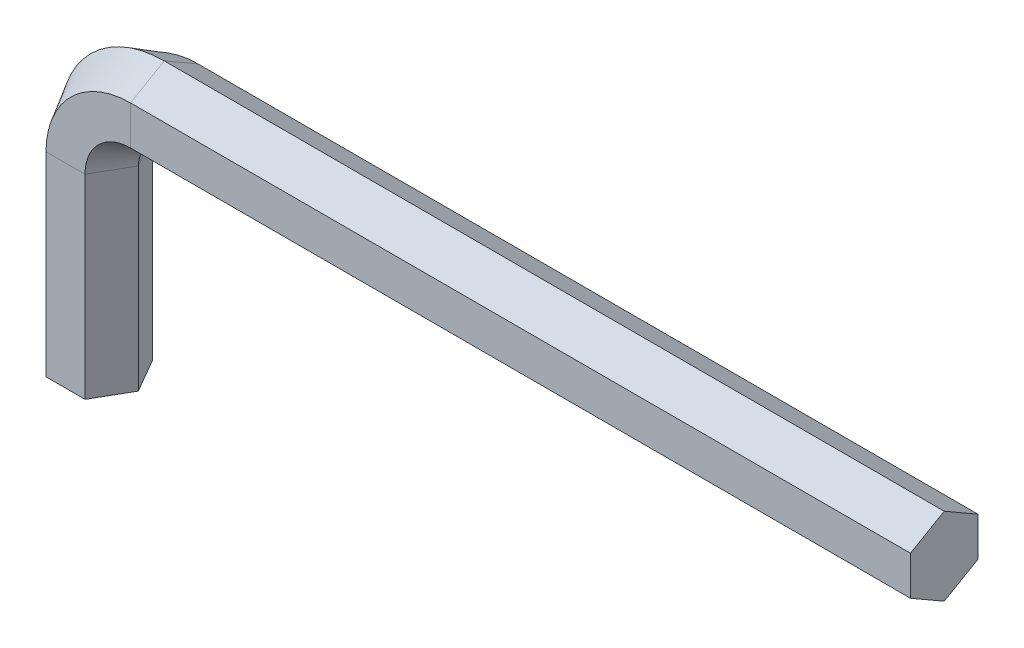
ISO-10303-21;
HEADER;
FILE_DESCRIPTION(('STEP AP214'),'2;1');
FILE_NAME('part.step','',(''),(''),'','','');
FILE_SCHEMA(('AUTOMOTIVE_DESIGN { 1 0 10303 214 1 1 1 1 }'));
ENDSEC;
DATA;
#1=APPLICATION_CONTEXT('core data for automotive mechanical design processes');
#2=APPLICATION_PROTOCOL_DEFINITION('international standard','automotive_design',2000,#1);
#3=PRODUCT_CONTEXT('',#1,'mechanical');
#4=PRODUCT('Part','Part','',(#3));
#5=PRODUCT_RELATED_PRODUCT_CATEGORY('part','',(#4));
#6=PRODUCT_DEFINITION_FORMATION('','',#4);
#7=PRODUCT_DEFINITION_CONTEXT('part definition',#1,'design');
#8=PRODUCT_DEFINITION('design','',#6,#7);
#9=PRODUCT_DEFINITION_SHAPE('','',#8);
#10=(LENGTH_UNIT() NAMED_UNIT(*) SI_UNIT(.MILLI.,.METRE.));
#11=(NAMED_UNIT(*) PLANE_ANGLE_UNIT() SI_UNIT($,.RADIAN.));
#12=(NAMED_UNIT(*) SI_UNIT($,.STERADIAN.) SOLID_ANGLE_UNIT());
#13=UNCERTAINTY_MEASURE_WITH_UNIT(LENGTH_MEASURE(1.E-05),#10,'distance_accuracy_value','');
#14=(GEOMETRIC_REPRESENTATION_CONTEXT(3) GLOBAL_UNCERTAINTY_ASSIGNED_CONTEXT((#13)) GLOBAL_UNIT_ASSIGNED_CONTEXT((#10,
#11,#12)) REPRESENTATION_CONTEXT('',''));
#15=CARTESIAN_POINT('',(0.,0.,0.));
#16=DIRECTION('',(0.,0.,1.));
#17=DIRECTION('',(1.,0.,0.));
#18=AXIS2_PLACEMENT_3D('',#15,#16,#17);
#19=CARTESIAN_POINT('',(0.,0.,0.));
#20=DIRECTION('',(0.,1.,0.));
#21=DIRECTION('',(0.,0.,1.));
#22=AXIS2_PLACEMENT_3D('',#19,#20,#21);
#23=PLANE('',#22);
#24=DIRECTION('',(0.499999999999995,0.,-0.866025403784442));
#25=VECTOR('',#24,1.);
#26=CARTESIAN_POINT('',(1.50000000000003,0.,2.59807621135329));
#27=LINE('',#26,#25);
#28=CARTESIAN_POINT('',(1.50000000000003,0.,2.59807621135329));
#29=VERTEX_POINT('',#28);
#30=CARTESIAN_POINT('',(2.99999999999999,0.,0.));
#31=VERTEX_POINT('',#30);
#32=EDGE_CURVE('E182',#29,#31,#27,.T.);
#33=ORIENTED_EDGE('',*,*,#32,.F.);
#34=DIRECTION('',(1.,0.,0.));
#35=VECTOR('',#34,1.);
#36=CARTESIAN_POINT('',(-1.49999999999997,0.,2.59807621135332));
#37=LINE('',#36,#35);
#38=CARTESIAN_POINT('',(-1.49999999999997,0.,2.59807621135332));
#39=VERTEX_POINT('',#38);
#40=EDGE_CURVE('E224',#39,#29,#37,.T.);
#41=ORIENTED_EDGE('',*,*,#40,.F.);
#42=DIRECTION('',(0.500000000000007,0.,0.866025403784435));
#43=VECTOR('',#42,1.);
#44=CARTESIAN_POINT('',(-2.99999999999999,0.,0.));
#45=LINE('',#44,#43);
#46=CARTESIAN_POINT('',(-2.99999999999999,0.,0.));
#47=VERTEX_POINT('',#46);
#48=EDGE_CURVE('E211',#47,#39,#45,.T.);
#49=ORIENTED_EDGE('',*,*,#48,.F.);
#50=DIRECTION('',(-0.499999999999995,0.,0.866025403784441));
#51=VECTOR('',#50,1.);
#52=CARTESIAN_POINT('',(-1.50000000000001,0.,-2.5980762113533));
#53=LINE('',#52,#51);
#54=CARTESIAN_POINT('',(-1.50000000000001,0.,-2.5980762113533));
#55=VERTEX_POINT('',#54);
#56=EDGE_CURVE('E134',#55,#47,#53,.T.);
#57=ORIENTED_EDGE('',*,*,#56,.F.);
#58=DIRECTION('',(-1.,0.,0.));
#59=VECTOR('',#58,1.);
#60=CARTESIAN_POINT('',(1.49999999999999,0.,-2.59807621135331));
#61=LINE('',#60,#59);
#62=CARTESIAN_POINT('',(1.49999999999999,0.,-2.59807621135331));
#63=VERTEX_POINT('',#62);
#64=EDGE_CURVE('E138',#63,#55,#61,.T.);
#65=ORIENTED_EDGE('',*,*,#64,.F.);
#66=DIRECTION('',(-0.500000000000001,0.,-0.866025403784438));
#67=VECTOR('',#66,1.);
#68=CARTESIAN_POINT('',(2.99999999999999,0.,0.));
#69=LINE('',#68,#67);
#70=EDGE_CURVE('E143',#31,#63,#69,.T.);
#71=ORIENTED_EDGE('',*,*,#70,.F.);
#72=EDGE_LOOP('',(#33,#41,#49,#57,#65,#71));
#73=FACE_BOUND('',#72,.T.);
#74=ADVANCED_FACE('F33',(#73),#23,.F.);
#75=CARTESIAN_POINT('',(65.,20.,0.));
#76=DIRECTION('',(1.,0.,0.));
#77=DIRECTION('',(0.,0.,1.));
#78=AXIS2_PLACEMENT_3D('',#75,#76,#77);
#79=PLANE('',#78);
#80=DIRECTION('',(0.,-0.499999999999995,-0.866025403784442));
#81=VECTOR('',#80,1.);
#82=CARTESIAN_POINT('',(65.,18.5,2.59807621135329));
#83=LINE('',#82,#81);
#84=CARTESIAN_POINT('',(65.,18.5,2.59807621135329));
#85=VERTEX_POINT('',#84);
#86=CARTESIAN_POINT('',(65.,17.,0.));
#87=VERTEX_POINT('',#86);
#88=EDGE_CURVE('E154',#85,#87,#83,.T.);
#89=ORIENTED_EDGE('',*,*,#88,.T.);
#90=DIRECTION('',(0.,0.500000000000001,-0.866025403784438));
#91=VECTOR('',#90,1.);
#92=CARTESIAN_POINT('',(65.,17.,0.));
#93=LINE('',#92,#91);
#94=CARTESIAN_POINT('',(65.,18.5,-2.59807621135331));
#95=VERTEX_POINT('',#94);
#96=EDGE_CURVE('E157',#87,#95,#93,.T.);
#97=ORIENTED_EDGE('',*,*,#96,.T.);
#98=DIRECTION('',(0.,1.,0.));
#99=VECTOR('',#98,1.);
#100=CARTESIAN_POINT('',(65.,18.5,-2.59807621135331));
#101=LINE('',#100,#99);
#102=CARTESIAN_POINT('',(65.,21.5,-2.5980762113533));
#103=VERTEX_POINT('',#102);
#104=EDGE_CURVE('E197',#95,#103,#101,.T.);
#105=ORIENTED_EDGE('',*,*,#104,.T.);
#106=DIRECTION('',(0.,0.499999999999995,0.866025403784441));
#107=VECTOR('',#106,1.);
#108=CARTESIAN_POINT('',(65.,21.5,-2.5980762113533));
#109=LINE('',#108,#107);
#110=CARTESIAN_POINT('',(65.,23.,0.));
#111=VERTEX_POINT('',#110);
#112=EDGE_CURVE('E52',#103,#111,#109,.T.);
#113=ORIENTED_EDGE('',*,*,#112,.T.);
#114=DIRECTION('',(0.,-0.500000000000007,0.866025403784435));
#115=VECTOR('',#114,1.);
#116=CARTESIAN_POINT('',(65.,23.,0.));
#117=LINE('',#116,#115);
#118=CARTESIAN_POINT('',(65.,21.5,2.59807621135332));
#119=VERTEX_POINT('',#118);
#120=EDGE_CURVE('E46',#111,#119,#117,.T.);
#121=ORIENTED_EDGE('',*,*,#120,.T.);
#122=DIRECTION('',(0.,-1.,0.));
#123=VECTOR('',#122,1.);
#124=CARTESIAN_POINT('',(65.,21.5,2.59807621135332));
#125=LINE('',#124,#123);
#126=EDGE_CURVE('E11',#119,#85,#125,.T.);
#127=ORIENTED_EDGE('',*,*,#126,.T.);
#128=EDGE_LOOP('',(#89,#97,#105,#113,#121,#127));
#129=FACE_BOUND('',#128,.T.);
#130=ADVANCED_FACE('F156',(#129),#79,.T.);
#131=CARTESIAN_POINT('',(1.50000000000003,0.,2.59807621135329));
#132=DIRECTION('',(0.866025403784441,0.,0.499999999999995));
#133=DIRECTION('',(0.499999999999995,0.,-0.866025403784441));
#134=AXIS2_PLACEMENT_3D('',#131,#132,#133);
#135=PLANE('',#134);
#136=DIRECTION('',(0.,1.,0.));
#137=VECTOR('',#136,1.);
#138=CARTESIAN_POINT('',(2.99999999999999,0.,0.));
#139=LINE('',#138,#137);
#140=CARTESIAN_POINT('',(2.99999999999999,15.,0.));
#141=VERTEX_POINT('',#140);
#142=EDGE_CURVE('E187',#31,#141,#139,.T.);
#143=ORIENTED_EDGE('',*,*,#142,.T.);
#144=DIRECTION('',(0.499999999999995,0.,-0.866025403784442));
#145=VECTOR('',#144,1.);
#146=CARTESIAN_POINT('',(1.50000000000003,15.,2.59807621135329));
#147=LINE('',#146,#145);
#148=CARTESIAN_POINT('',(1.50000000000003,15.,2.59807621135329));
#149=VERTEX_POINT('',#148);
#150=EDGE_CURVE('E256',#149,#141,#147,.T.);
#151=ORIENTED_EDGE('',*,*,#150,.F.);
#152=DIRECTION('',(0.,1.,0.));
#153=VECTOR('',#152,1.);
#154=CARTESIAN_POINT('',(1.50000000000003,0.,2.59807621135329));
#155=LINE('',#154,#153);
#156=EDGE_CURVE('E238',#29,#149,#155,.T.);
#157=ORIENTED_EDGE('',*,*,#156,.F.);
#158=ORIENTED_EDGE('',*,*,#32,.T.);
#159=EDGE_LOOP('',(#143,#151,#157,#158));
#160=FACE_BOUND('',#159,.T.);
#161=ADVANCED_FACE('F263',(#160),#135,.T.);
#162=CARTESIAN_POINT('',(2.99999999999999,0.,0.));
#163=DIRECTION('',(0.866025403784438,0.,-0.500000000000001));
#164=DIRECTION('',(-0.500000000000001,0.,-0.866025403784438));
#165=AXIS2_PLACEMENT_3D('',#162,#163,#164);
#166=PLANE('',#165);
#167=DIRECTION('',(0.,1.,0.));
#168=VECTOR('',#167,1.);
#169=CARTESIAN_POINT('',(1.49999999999999,0.,-2.59807621135331));
#170=LINE('',#169,#168);
#171=CARTESIAN_POINT('',(1.49999999999999,15.,-2.59807621135331));
#172=VERTEX_POINT('',#171);
#173=EDGE_CURVE('E186',#63,#172,#170,.T.);
#174=ORIENTED_EDGE('',*,*,#173,.T.);
#175=DIRECTION('',(-0.500000000000001,0.,-0.866025403784438));
#176=VECTOR('',#175,1.);
#177=CARTESIAN_POINT('',(2.99999999999999,15.,0.));
#178=LINE('',#177,#176);
#179=EDGE_CURVE('E183',#141,#172,#178,.T.);
#180=ORIENTED_EDGE('',*,*,#179,.F.);
#181=ORIENTED_EDGE('',*,*,#142,.F.);
#182=ORIENTED_EDGE('',*,*,#70,.T.);
#183=EDGE_LOOP('',(#174,#180,#181,#182));
#184=FACE_BOUND('',#183,.T.);
#185=ADVANCED_FACE('F266',(#184),#166,.T.);
#186=CARTESIAN_POINT('',(1.49999999999999,0.,-2.59807621135331));
#187=DIRECTION('',(0.,0.,-1.));
#188=DIRECTION('',(-1.,0.,0.));
#189=AXIS2_PLACEMENT_3D('',#186,#187,#188);
#190=PLANE('',#189);
#191=DIRECTION('',(0.,1.,0.));
#192=VECTOR('',#191,1.);
#193=CARTESIAN_POINT('',(-1.50000000000001,0.,-2.5980762113533));
#194=LINE('',#193,#192);
#195=CARTESIAN_POINT('',(-1.50000000000001,15.,-2.5980762113533));
#196=VERTEX_POINT('',#195);
#197=EDGE_CURVE('E200',#55,#196,#194,.T.);
#198=ORIENTED_EDGE('',*,*,#197,.T.);
#199=DIRECTION('',(-1.,0.,0.));
#200=VECTOR('',#199,1.);
#201=CARTESIAN_POINT('',(1.49999999999999,15.,-2.59807621135331));
#202=LINE('',#201,#200);
#203=EDGE_CURVE('E190',#172,#196,#202,.T.);
#204=ORIENTED_EDGE('',*,*,#203,.F.);
#205=ORIENTED_EDGE('',*,*,#173,.F.);
#206=ORIENTED_EDGE('',*,*,#64,.T.);
#207=EDGE_LOOP('',(#198,#204,#205,#206));
#208=FACE_BOUND('',#207,.T.);
#209=ADVANCED_FACE('F320',(#208),#190,.T.);
#210=CARTESIAN_POINT('',(-1.50000000000001,0.,-2.5980762113533));
#211=DIRECTION('',(-0.866025403784442,0.,-0.499999999999995));
#212=DIRECTION('',(-0.499999999999995,0.,0.866025403784442));
#213=AXIS2_PLACEMENT_3D('',#210,#211,#212);
#214=PLANE('',#213);
#215=DIRECTION('',(0.,1.,0.));
#216=VECTOR('',#215,1.);
#217=CARTESIAN_POINT('',(-2.99999999999999,0.,0.));
#218=LINE('',#217,#216);
#219=CARTESIAN_POINT('',(-2.99999999999999,15.,0.));
#220=VERTEX_POINT('',#219);
#221=EDGE_CURVE('E213',#47,#220,#218,.T.);
#222=ORIENTED_EDGE('',*,*,#221,.T.);
#223=DIRECTION('',(-0.499999999999995,0.,0.866025403784441));
#224=VECTOR('',#223,1.);
#225=CARTESIAN_POINT('',(-1.50000000000001,15.,-2.5980762113533));
#226=LINE('',#225,#224);
#227=EDGE_CURVE('E203',#196,#220,#226,.T.);
#228=ORIENTED_EDGE('',*,*,#227,.F.);
#229=ORIENTED_EDGE('',*,*,#197,.F.);
#230=ORIENTED_EDGE('',*,*,#56,.T.);
#231=EDGE_LOOP('',(#222,#228,#229,#230));
#232=FACE_BOUND('',#231,.T.);
#233=ADVANCED_FACE('F328',(#232),#214,.T.);
#234=CARTESIAN_POINT('',(-2.99999999999999,0.,0.));
#235=DIRECTION('',(-0.866025403784435,0.,0.500000000000007));
#236=DIRECTION('',(0.500000000000007,0.,0.866025403784435));
#237=AXIS2_PLACEMENT_3D('',#234,#235,#236);
#238=PLANE('',#237);
#239=DIRECTION('',(0.,1.,0.));
#240=VECTOR('',#239,1.);
#241=CARTESIAN_POINT('',(-1.49999999999997,0.,2.59807621135332));
#242=LINE('',#241,#240);
#243=CARTESIAN_POINT('',(-1.49999999999997,15.,2.59807621135332));
#244=VERTEX_POINT('',#243);
#245=EDGE_CURVE('E226',#39,#244,#242,.T.);
#246=ORIENTED_EDGE('',*,*,#245,.T.);
#247=DIRECTION('',(0.500000000000007,0.,0.866025403784435));
#248=VECTOR('',#247,1.);
#249=CARTESIAN_POINT('',(-2.99999999999999,15.,0.));
#250=LINE('',#249,#248);
#251=EDGE_CURVE('E216',#220,#244,#250,.T.);
#252=ORIENTED_EDGE('',*,*,#251,.F.);
#253=ORIENTED_EDGE('',*,*,#221,.F.);
#254=ORIENTED_EDGE('',*,*,#48,.T.);
#255=EDGE_LOOP('',(#246,#252,#253,#254));
#256=FACE_BOUND('',#255,.T.);
#257=ADVANCED_FACE('F338',(#256),#238,.T.);
#258=CARTESIAN_POINT('',(-1.49999999999997,0.,2.59807621135332));
#259=DIRECTION('',(0.,0.,1.));
#260=DIRECTION('',(1.,0.,0.));
#261=AXIS2_PLACEMENT_3D('',#258,#259,#260);
#262=PLANE('',#261);
#263=DIRECTION('',(1.,0.,0.));
#264=VECTOR('',#263,1.);
#265=CARTESIAN_POINT('',(-1.49999999999997,15.,2.59807621135332));
#266=LINE('',#265,#264);
#267=EDGE_CURVE('E229',#244,#149,#266,.T.);
#268=ORIENTED_EDGE('',*,*,#267,.F.);
#269=ORIENTED_EDGE('',*,*,#245,.F.);
#270=ORIENTED_EDGE('',*,*,#40,.T.);
#271=ORIENTED_EDGE('',*,*,#156,.T.);
#272=EDGE_LOOP('',(#268,#269,#270,#271));
#273=FACE_BOUND('',#272,.T.);
#274=ADVANCED_FACE('F279',(#273),#262,.T.);
#275=CARTESIAN_POINT('',(5.,15.,2.59807621135329));
#276=DIRECTION('',(0.,0.,1.));
#277=DIRECTION('',(1.,0.,0.));
#278=AXIS2_PLACEMENT_3D('',#275,#276,#277);
#279=CONICAL_SURFACE('',#278,3.49999999999997,0.523598775598293);
#280=CARTESIAN_POINT('',(5.,15.,0.));
#281=DIRECTION('',(0.,0.,-1.));
#282=DIRECTION('',(-1.,0.,0.));
#283=AXIS2_PLACEMENT_3D('',#280,#281,#282);
#284=CIRCLE('',#283,2.);
#285=CARTESIAN_POINT('',(5.00000000000001,17.,0.));
#286=VERTEX_POINT('',#285);
#287=EDGE_CURVE('E193',#141,#286,#284,.T.);
#288=ORIENTED_EDGE('',*,*,#287,.T.);
#289=DIRECTION('',(0.,-0.499999999999995,-0.866025403784442));
#290=VECTOR('',#289,1.);
#291=CARTESIAN_POINT('',(5.00000000000002,18.5,2.59807621135329));
#292=LINE('',#291,#290);
#293=CARTESIAN_POINT('',(5.00000000000002,18.5,2.59807621135329));
#294=VERTEX_POINT('',#293);
#295=EDGE_CURVE('E175',#294,#286,#292,.T.);
#296=ORIENTED_EDGE('',*,*,#295,.F.);
#297=CARTESIAN_POINT('',(5.,15.,2.59807621135329));
#298=DIRECTION('',(0.,0.,-1.));
#299=DIRECTION('',(-1.,0.,0.));
#300=AXIS2_PLACEMENT_3D('',#297,#298,#299);
#301=CIRCLE('',#300,3.49999999999997);
#302=EDGE_CURVE('E240',#149,#294,#301,.T.);
#303=ORIENTED_EDGE('',*,*,#302,.F.);
#304=ORIENTED_EDGE('',*,*,#150,.T.);
#305=EDGE_LOOP('',(#288,#296,#303,#304));
#306=FACE_BOUND('',#305,.T.);
#307=ADVANCED_FACE('F246',(#306),#279,.F.);
#308=CARTESIAN_POINT('',(5.,15.,0.));
#309=DIRECTION('',(0.,0.,-1.));
#310=DIRECTION('',(-1.,0.,0.));
#311=AXIS2_PLACEMENT_3D('',#308,#309,#310);
#312=CONICAL_SURFACE('',#311,2.,0.5235987755983);
#313=CARTESIAN_POINT('',(5.,15.,-2.59807621135331));
#314=DIRECTION('',(0.,0.,-1.));
#315=DIRECTION('',(-1.,0.,0.));
#316=AXIS2_PLACEMENT_3D('',#313,#314,#315);
#317=CIRCLE('',#316,3.50000000000001);
#318=CARTESIAN_POINT('',(5.00000000000002,18.5,-2.59807621135331));
#319=VERTEX_POINT('',#318);
#320=EDGE_CURVE('E121',#172,#319,#317,.T.);
#321=ORIENTED_EDGE('',*,*,#320,.T.);
#322=DIRECTION('',(0.,0.500000000000001,-0.866025403784438));
#323=VECTOR('',#322,1.);
#324=CARTESIAN_POINT('',(5.00000000000001,17.,0.));
#325=LINE('',#324,#323);
#326=EDGE_CURVE('E191',#286,#319,#325,.T.);
#327=ORIENTED_EDGE('',*,*,#326,.F.);
#328=ORIENTED_EDGE('',*,*,#287,.F.);
#329=ORIENTED_EDGE('',*,*,#179,.T.);
#330=EDGE_LOOP('',(#321,#327,#328,#329));
#331=FACE_BOUND('',#330,.T.);
#332=ADVANCED_FACE('F269',(#331),#312,.F.);
#333=CARTESIAN_POINT('',(1.49999999999999,15.,-2.59807621135331));
#334=DIRECTION('',(0.,0.,-1.));
#335=DIRECTION('',(-1.,0.,0.));
#336=AXIS2_PLACEMENT_3D('',#333,#334,#335);
#337=PLANE('',#336);
#338=CARTESIAN_POINT('',(5.,15.,-2.5980762113533));
#339=DIRECTION('',(0.,0.,-1.));
#340=DIRECTION('',(-1.,0.,0.));
#341=AXIS2_PLACEMENT_3D('',#338,#339,#340);
#342=CIRCLE('',#341,6.50000000000001);
#343=CARTESIAN_POINT('',(5.00000000000004,21.5,-2.5980762113533));
#344=VERTEX_POINT('',#343);
#345=EDGE_CURVE('E112',#196,#344,#342,.T.);
#346=ORIENTED_EDGE('',*,*,#345,.T.);
#347=DIRECTION('',(0.,1.,0.));
#348=VECTOR('',#347,1.);
#349=CARTESIAN_POINT('',(5.00000000000002,18.5,-2.59807621135331));
#350=LINE('',#349,#348);
#351=EDGE_CURVE('E194',#319,#344,#350,.T.);
#352=ORIENTED_EDGE('',*,*,#351,.F.);
#353=ORIENTED_EDGE('',*,*,#320,.F.);
#354=ORIENTED_EDGE('',*,*,#203,.T.);
#355=EDGE_LOOP('',(#346,#352,#353,#354));
#356=FACE_BOUND('',#355,.T.);
#357=ADVANCED_FACE('F271',(#356),#337,.T.);
#358=CARTESIAN_POINT('',(5.,15.,-2.5980762113533));
#359=DIRECTION('',(0.,0.,1.));
#360=DIRECTION('',(1.,0.,0.));
#361=AXIS2_PLACEMENT_3D('',#358,#359,#360);
#362=CONICAL_SURFACE('',#361,6.50000000000001,0.523598775598293);
#363=CARTESIAN_POINT('',(5.,15.,0.));
#364=DIRECTION('',(0.,0.,-1.));
#365=DIRECTION('',(-1.,0.,0.));
#366=AXIS2_PLACEMENT_3D('',#363,#364,#365);
#367=CIRCLE('',#366,7.99999999999999);
#368=CARTESIAN_POINT('',(5.00000000000006,23.,0.));
#369=VERTEX_POINT('',#368);
#370=EDGE_CURVE('E105',#220,#369,#367,.T.);
#371=ORIENTED_EDGE('',*,*,#370,.T.);
#372=DIRECTION('',(0.,0.499999999999995,0.866025403784441));
#373=VECTOR('',#372,1.);
#374=CARTESIAN_POINT('',(5.00000000000004,21.5,-2.5980762113533));
#375=LINE('',#374,#373);
#376=EDGE_CURVE('E207',#344,#369,#375,.T.);
#377=ORIENTED_EDGE('',*,*,#376,.F.);
#378=ORIENTED_EDGE('',*,*,#345,.F.);
#379=ORIENTED_EDGE('',*,*,#227,.T.);
#380=EDGE_LOOP('',(#371,#377,#378,#379));
#381=FACE_BOUND('',#380,.T.);
#382=ADVANCED_FACE('F277',(#381),#362,.T.);
#383=CARTESIAN_POINT('',(5.,15.,0.));
#384=DIRECTION('',(0.,0.,-1.));
#385=DIRECTION('',(-1.,0.,0.));
#386=AXIS2_PLACEMENT_3D('',#383,#384,#385);
#387=CONICAL_SURFACE('',#386,7.99999999999999,0.523598775598307);
#388=CARTESIAN_POINT('',(5.,15.,2.59807621135332));
#389=DIRECTION('',(0.,0.,-1.));
#390=DIRECTION('',(-1.,0.,0.));
#391=AXIS2_PLACEMENT_3D('',#388,#389,#390);
#392=CIRCLE('',#391,6.49999999999997);
#393=CARTESIAN_POINT('',(5.00000000000004,21.5,2.59807621135332));
#394=VERTEX_POINT('',#393);
#395=EDGE_CURVE('E231',#244,#394,#392,.T.);
#396=ORIENTED_EDGE('',*,*,#395,.T.);
#397=DIRECTION('',(0.,-0.500000000000007,0.866025403784435));
#398=VECTOR('',#397,1.);
#399=CARTESIAN_POINT('',(5.00000000000006,23.,0.));
#400=LINE('',#399,#398);
#401=EDGE_CURVE('E219',#369,#394,#400,.T.);
#402=ORIENTED_EDGE('',*,*,#401,.F.);
#403=ORIENTED_EDGE('',*,*,#370,.F.);
#404=ORIENTED_EDGE('',*,*,#251,.T.);
#405=EDGE_LOOP('',(#396,#402,#403,#404));
#406=FACE_BOUND('',#405,.T.);
#407=ADVANCED_FACE('F381',(#406),#387,.T.);
#408=CARTESIAN_POINT('',(-1.49999999999997,15.,2.59807621135331));
#409=DIRECTION('',(0.,0.,1.));
#410=DIRECTION('',(1.,0.,0.));
#411=AXIS2_PLACEMENT_3D('',#408,#409,#410);
#412=PLANE('',#411);
#413=DIRECTION('',(0.,-1.,0.));
#414=VECTOR('',#413,1.);
#415=CARTESIAN_POINT('',(5.00000000000004,21.5,2.59807621135332));
#416=LINE('',#415,#414);
#417=EDGE_CURVE('E180',#394,#294,#416,.T.);
#418=ORIENTED_EDGE('',*,*,#417,.F.);
#419=ORIENTED_EDGE('',*,*,#395,.F.);
#420=ORIENTED_EDGE('',*,*,#267,.T.);
#421=ORIENTED_EDGE('',*,*,#302,.T.);
#422=EDGE_LOOP('',(#418,#419,#420,#421));
#423=FACE_BOUND('',#422,.T.);
#424=ADVANCED_FACE('F249',(#423),#412,.T.);
#425=CARTESIAN_POINT('',(5.00000000000004,18.5,2.59807621135329));
#426=DIRECTION('',(0.,-0.866025403784441,0.499999999999995));
#427=DIRECTION('',(0.,-0.499999999999995,-0.866025403784442));
#428=AXIS2_PLACEMENT_3D('',#425,#426,#427);
#429=PLANE('',#428);
#430=DIRECTION('',(1.,0.,0.));
#431=VECTOR('',#430,1.);
#432=CARTESIAN_POINT('',(5.00000000000004,17.,0.));
#433=LINE('',#432,#431);
#434=EDGE_CURVE('E162',#286,#87,#433,.T.);
#435=ORIENTED_EDGE('',*,*,#434,.T.);
#436=ORIENTED_EDGE('',*,*,#88,.F.);
#437=DIRECTION('',(1.,0.,0.));
#438=VECTOR('',#437,1.);
#439=CARTESIAN_POINT('',(5.00000000000004,18.5,2.59807621135329));
#440=LINE('',#439,#438);
#441=EDGE_CURVE('E163',#294,#85,#440,.T.);
#442=ORIENTED_EDGE('',*,*,#441,.F.);
#443=ORIENTED_EDGE('',*,*,#295,.T.);
#444=EDGE_LOOP('',(#435,#436,#442,#443));
#445=FACE_BOUND('',#444,.T.);
#446=ADVANCED_FACE('F173',(#445),#429,.T.);
#447=CARTESIAN_POINT('',(5.00000000000004,17.,0.));
#448=DIRECTION('',(0.,-0.866025403784438,-0.500000000000001));
#449=DIRECTION('',(0.,0.500000000000001,-0.866025403784438));
#450=AXIS2_PLACEMENT_3D('',#447,#448,#449);
#451=PLANE('',#450);
#452=DIRECTION('',(1.,0.,0.));
#453=VECTOR('',#452,1.);
#454=CARTESIAN_POINT('',(5.00000000000004,18.5,-2.59807621135331));
#455=LINE('',#454,#453);
#456=EDGE_CURVE('E170',#319,#95,#455,.T.);
#457=ORIENTED_EDGE('',*,*,#456,.T.);
#458=ORIENTED_EDGE('',*,*,#96,.F.);
#459=ORIENTED_EDGE('',*,*,#434,.F.);
#460=ORIENTED_EDGE('',*,*,#326,.T.);
#461=EDGE_LOOP('',(#457,#458,#459,#460));
#462=FACE_BOUND('',#461,.T.);
#463=ADVANCED_FACE('F167',(#462),#451,.T.);
#464=CARTESIAN_POINT('',(5.00000000000004,18.5,-2.59807621135331));
#465=DIRECTION('',(0.,0.,-1.));
#466=DIRECTION('',(0.,1.,0.));
#467=AXIS2_PLACEMENT_3D('',#464,#465,#466);
#468=PLANE('',#467);
#469=DIRECTION('',(1.,0.,0.));
#470=VECTOR('',#469,1.);
#471=CARTESIAN_POINT('',(5.00000000000004,21.5,-2.5980762113533));
#472=LINE('',#471,#470);
#473=EDGE_CURVE('E90',#344,#103,#472,.T.);
#474=ORIENTED_EDGE('',*,*,#473,.T.);
#475=ORIENTED_EDGE('',*,*,#104,.F.);
#476=ORIENTED_EDGE('',*,*,#456,.F.);
#477=ORIENTED_EDGE('',*,*,#351,.T.);
#478=EDGE_LOOP('',(#474,#475,#476,#477));
#479=FACE_BOUND('',#478,.T.);
#480=ADVANCED_FACE('F413',(#479),#468,.T.);
#481=CARTESIAN_POINT('',(5.00000000000004,21.5,-2.5980762113533));
#482=DIRECTION('',(0.,0.866025403784442,-0.499999999999995));
#483=DIRECTION('',(0.,0.499999999999995,0.866025403784442));
#484=AXIS2_PLACEMENT_3D('',#481,#482,#483);
#485=PLANE('',#484);
#486=DIRECTION('',(1.,0.,0.));
#487=VECTOR('',#486,1.);
#488=CARTESIAN_POINT('',(5.00000000000004,23.,0.));
#489=LINE('',#488,#487);
#490=EDGE_CURVE('E82',#369,#111,#489,.T.);
#491=ORIENTED_EDGE('',*,*,#490,.T.);
#492=ORIENTED_EDGE('',*,*,#112,.F.);
#493=ORIENTED_EDGE('',*,*,#473,.F.);
#494=ORIENTED_EDGE('',*,*,#376,.T.);
#495=EDGE_LOOP('',(#491,#492,#493,#494));
#496=FACE_BOUND('',#495,.T.);
#497=ADVANCED_FACE('F289',(#496),#485,.T.);
#498=CARTESIAN_POINT('',(5.00000000000004,23.,0.));
#499=DIRECTION('',(0.,0.866025403784435,0.500000000000007));
#500=DIRECTION('',(0.,-0.500000000000007,0.866025403784435));
#501=AXIS2_PLACEMENT_3D('',#498,#499,#500);
#502=PLANE('',#501);
#503=DIRECTION('',(1.,0.,0.));
#504=VECTOR('',#503,1.);
#505=CARTESIAN_POINT('',(5.00000000000004,21.5,2.59807621135332));
#506=LINE('',#505,#504);
#507=EDGE_CURVE('E40',#394,#119,#506,.T.);
#508=ORIENTED_EDGE('',*,*,#507,.T.);
#509=ORIENTED_EDGE('',*,*,#120,.F.);
#510=ORIENTED_EDGE('',*,*,#490,.F.);
#511=ORIENTED_EDGE('',*,*,#401,.T.);
#512=EDGE_LOOP('',(#508,#509,#510,#511));
#513=FACE_BOUND('',#512,.T.);
#514=ADVANCED_FACE('F284',(#513),#502,.T.);
#515=CARTESIAN_POINT('',(5.00000000000004,21.5,2.59807621135332));
#516=DIRECTION('',(0.,0.,1.));
#517=DIRECTION('',(0.,-1.,0.));
#518=AXIS2_PLACEMENT_3D('',#515,#516,#517);
#519=PLANE('',#518);
#520=ORIENTED_EDGE('',*,*,#126,.F.);
#521=ORIENTED_EDGE('',*,*,#507,.F.);
#522=ORIENTED_EDGE('',*,*,#417,.T.);
#523=ORIENTED_EDGE('',*,*,#441,.T.);
#524=EDGE_LOOP('',(#520,#521,#522,#523));
#525=FACE_BOUND('',#524,.T.);
#526=ADVANCED_FACE('F241',(#525),#519,.T.);
#527=CLOSED_SHELL('',(#74,#130,#161,#185,#209,#233,#257,#274,#307,#332,#357,#382,#407,#424,#446,
#463,#480,#497,#514,#526));
#528=MANIFOLD_SOLID_BREP('B2',#527);
#529=ADVANCED_BREP_SHAPE_REPRESENTATION('',(#18,#528),#14);
#530=SHAPE_DEFINITION_REPRESENTATION(#9,#529);
ENDSEC;
END-ISO-10303-21;
